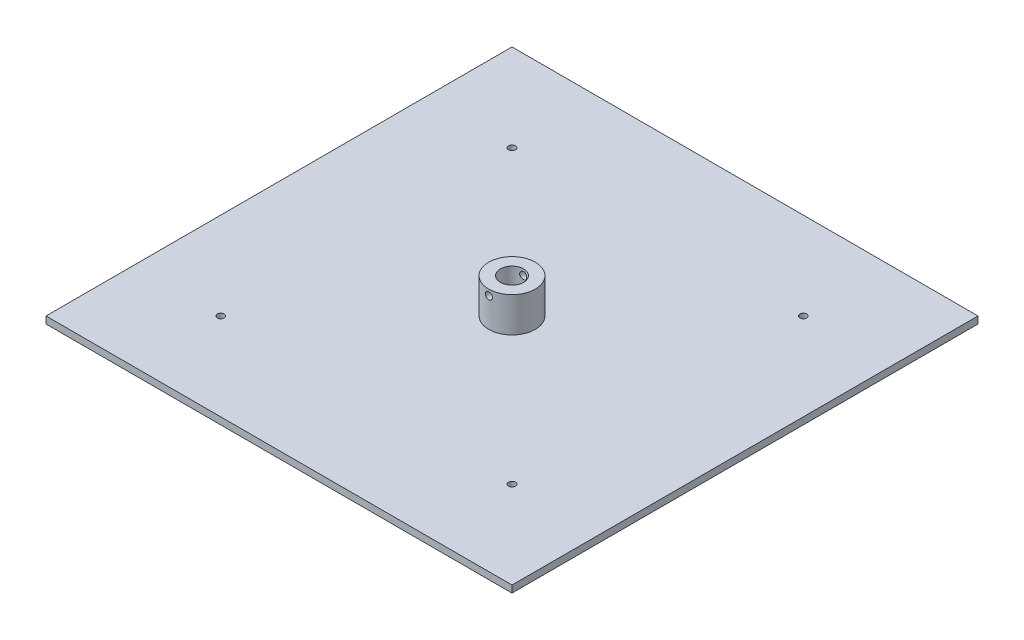
ISO-10303-21;
HEADER;
FILE_DESCRIPTION(('STEP AP214'),'2;1');
FILE_NAME('part.step','',(''),(''),'','','');
FILE_SCHEMA(('AUTOMOTIVE_DESIGN { 1 0 10303 214 1 1 1 1 }'));
ENDSEC;
DATA;
#1=APPLICATION_CONTEXT('core data for automotive mechanical design processes');
#2=APPLICATION_PROTOCOL_DEFINITION('international standard','automotive_design',2000,#1);
#3=PRODUCT_CONTEXT('',#1,'mechanical');
#4=PRODUCT('Part','Part','',(#3));
#5=PRODUCT_RELATED_PRODUCT_CATEGORY('part','',(#4));
#6=PRODUCT_DEFINITION_FORMATION('','',#4);
#7=PRODUCT_DEFINITION_CONTEXT('part definition',#1,'design');
#8=PRODUCT_DEFINITION('design','',#6,#7);
#9=PRODUCT_DEFINITION_SHAPE('','',#8);
#10=(LENGTH_UNIT() NAMED_UNIT(*) SI_UNIT(.MILLI.,.METRE.));
#11=(NAMED_UNIT(*) PLANE_ANGLE_UNIT() SI_UNIT($,.RADIAN.));
#12=(NAMED_UNIT(*) SI_UNIT($,.STERADIAN.) SOLID_ANGLE_UNIT());
#13=UNCERTAINTY_MEASURE_WITH_UNIT(LENGTH_MEASURE(1.E-05),#10,'distance_accuracy_value','');
#14=(GEOMETRIC_REPRESENTATION_CONTEXT(3) GLOBAL_UNCERTAINTY_ASSIGNED_CONTEXT((#13)) GLOBAL_UNIT_ASSIGNED_CONTEXT((#10,
#11,#12)) REPRESENTATION_CONTEXT('',''));
#15=CARTESIAN_POINT('',(0.,0.,0.));
#16=DIRECTION('',(0.,0.,1.));
#17=DIRECTION('',(1.,0.,0.));
#18=AXIS2_PLACEMENT_3D('',#15,#16,#17);
#19=CARTESIAN_POINT('',(0.,6.,0.));
#20=DIRECTION('',(0.,1.,0.));
#21=DIRECTION('',(0.,0.,1.));
#22=AXIS2_PLACEMENT_3D('',#19,#20,#21);
#23=PLANE('',#22);
#24=CARTESIAN_POINT('',(0.,6.,0.));
#25=DIRECTION('',(0.,1.,0.));
#26=DIRECTION('',(0.,0.,1.));
#27=AXIS2_PLACEMENT_3D('',#24,#25,#26);
#28=CIRCLE('',#27,20.);
#29=CARTESIAN_POINT('',(0.,6.,20.));
#30=VERTEX_POINT('',#29);
#31=EDGE_CURVE('E230',#30,#30,#28,.T.);
#32=ORIENTED_EDGE('',*,*,#31,.F.);
#33=EDGE_LOOP('',(#32));
#34=FACE_BOUND('',#33,.T.);
#35=CARTESIAN_POINT('',(125.000000000003,6.,125.));
#36=DIRECTION('',(0.,1.,0.));
#37=DIRECTION('',(0.,0.,1.));
#38=AXIS2_PLACEMENT_3D('',#35,#36,#37);
#39=CIRCLE('',#38,2.99999999999999);
#40=CARTESIAN_POINT('',(125.000000000003,6.,128.));
#41=VERTEX_POINT('',#40);
#42=EDGE_CURVE('E234',#41,#41,#39,.T.);
#43=ORIENTED_EDGE('',*,*,#42,.F.);
#44=EDGE_LOOP('',(#43));
#45=FACE_BOUND('',#44,.T.);
#46=CARTESIAN_POINT('',(-125.,6.,-125.));
#47=DIRECTION('',(0.,1.,0.));
#48=DIRECTION('',(0.,0.,1.));
#49=AXIS2_PLACEMENT_3D('',#46,#47,#48);
#50=CIRCLE('',#49,3.00000000000001);
#51=CARTESIAN_POINT('',(-125.,6.,-122.));
#52=VERTEX_POINT('',#51);
#53=EDGE_CURVE('E120',#52,#52,#50,.T.);
#54=ORIENTED_EDGE('',*,*,#53,.F.);
#55=EDGE_LOOP('',(#54));
#56=FACE_BOUND('',#55,.T.);
#57=DIRECTION('',(0.,0.,1.));
#58=VECTOR('',#57,1.);
#59=CARTESIAN_POINT('',(-200.,6.,-200.));
#60=LINE('',#59,#58);
#61=CARTESIAN_POINT('',(-200.,6.,-200.));
#62=VERTEX_POINT('',#61);
#63=CARTESIAN_POINT('',(-200.,6.,200.));
#64=VERTEX_POINT('',#63);
#65=EDGE_CURVE('E99',#62,#64,#60,.T.);
#66=ORIENTED_EDGE('',*,*,#65,.T.);
#67=DIRECTION('',(1.,0.,0.));
#68=VECTOR('',#67,1.);
#69=CARTESIAN_POINT('',(-200.,6.,200.));
#70=LINE('',#69,#68);
#71=CARTESIAN_POINT('',(200.,6.,200.));
#72=VERTEX_POINT('',#71);
#73=EDGE_CURVE('E94',#64,#72,#70,.T.);
#74=ORIENTED_EDGE('',*,*,#73,.T.);
#75=DIRECTION('',(0.,0.,-1.));
#76=VECTOR('',#75,1.);
#77=CARTESIAN_POINT('',(200.,6.,-200.));
#78=LINE('',#77,#76);
#79=CARTESIAN_POINT('',(200.,6.,-200.));
#80=VERTEX_POINT('',#79);
#81=EDGE_CURVE('E97',#72,#80,#78,.T.);
#82=ORIENTED_EDGE('',*,*,#81,.T.);
#83=DIRECTION('',(-1.,0.,0.));
#84=VECTOR('',#83,1.);
#85=CARTESIAN_POINT('',(-200.,6.,-200.));
#86=LINE('',#85,#84);
#87=EDGE_CURVE('E64',#80,#62,#86,.T.);
#88=ORIENTED_EDGE('',*,*,#87,.T.);
#89=EDGE_LOOP('',(#66,#74,#82,#88));
#90=FACE_BOUND('',#89,.T.);
#91=CARTESIAN_POINT('',(125.,6.,-125.));
#92=DIRECTION('',(0.,1.,0.));
#93=DIRECTION('',(0.,0.,1.));
#94=AXIS2_PLACEMENT_3D('',#91,#92,#93);
#95=CIRCLE('',#94,2.99999999999997);
#96=CARTESIAN_POINT('',(125.,6.,-122.));
#97=VERTEX_POINT('',#96);
#98=EDGE_CURVE('E240',#97,#97,#95,.T.);
#99=ORIENTED_EDGE('',*,*,#98,.F.);
#100=EDGE_LOOP('',(#99));
#101=FACE_BOUND('',#100,.T.);
#102=CARTESIAN_POINT('',(-124.999999999997,6.,125.));
#103=DIRECTION('',(0.,1.,0.));
#104=DIRECTION('',(0.,0.,1.));
#105=AXIS2_PLACEMENT_3D('',#102,#103,#104);
#106=CIRCLE('',#105,3.00000000000001);
#107=CARTESIAN_POINT('',(-124.999999999997,6.,128.));
#108=VERTEX_POINT('',#107);
#109=EDGE_CURVE('E222',#108,#108,#106,.T.);
#110=ORIENTED_EDGE('',*,*,#109,.F.);
#111=EDGE_LOOP('',(#110));
#112=FACE_BOUND('',#111,.T.);
#113=ADVANCED_FACE('F39',(#34,#45,#56,#90,#101,#112),#23,.T.);
#114=CARTESIAN_POINT('',(0.,0.,0.));
#115=DIRECTION('',(0.,1.,0.));
#116=DIRECTION('',(0.,0.,1.));
#117=AXIS2_PLACEMENT_3D('',#114,#115,#116);
#118=PLANE('',#117);
#119=CARTESIAN_POINT('',(0.,0.,0.));
#120=DIRECTION('',(0.,1.,0.));
#121=DIRECTION('',(0.,0.,1.));
#122=AXIS2_PLACEMENT_3D('',#119,#120,#121);
#123=CIRCLE('',#122,10.);
#124=CARTESIAN_POINT('',(0.,0.,10.));
#125=VERTEX_POINT('',#124);
#126=EDGE_CURVE('E263',#125,#125,#123,.T.);
#127=ORIENTED_EDGE('',*,*,#126,.T.);
#128=EDGE_LOOP('',(#127));
#129=FACE_BOUND('',#128,.T.);
#130=DIRECTION('',(0.,0.,1.));
#131=VECTOR('',#130,1.);
#132=CARTESIAN_POINT('',(-200.,0.,-200.));
#133=LINE('',#132,#131);
#134=CARTESIAN_POINT('',(-200.,0.,-200.));
#135=VERTEX_POINT('',#134);
#136=CARTESIAN_POINT('',(-200.,0.,200.));
#137=VERTEX_POINT('',#136);
#138=EDGE_CURVE('E116',#135,#137,#133,.T.);
#139=ORIENTED_EDGE('',*,*,#138,.F.);
#140=DIRECTION('',(-1.,0.,0.));
#141=VECTOR('',#140,1.);
#142=CARTESIAN_POINT('',(-200.,0.,-200.));
#143=LINE('',#142,#141);
#144=CARTESIAN_POINT('',(200.,0.,-200.));
#145=VERTEX_POINT('',#144);
#146=EDGE_CURVE('E87',#145,#135,#143,.T.);
#147=ORIENTED_EDGE('',*,*,#146,.F.);
#148=DIRECTION('',(0.,0.,-1.));
#149=VECTOR('',#148,1.);
#150=CARTESIAN_POINT('',(200.,0.,-200.));
#151=LINE('',#150,#149);
#152=CARTESIAN_POINT('',(200.,0.,200.));
#153=VERTEX_POINT('',#152);
#154=EDGE_CURVE('E81',#153,#145,#151,.T.);
#155=ORIENTED_EDGE('',*,*,#154,.F.);
#156=DIRECTION('',(1.,0.,0.));
#157=VECTOR('',#156,1.);
#158=CARTESIAN_POINT('',(-200.,0.,200.));
#159=LINE('',#158,#157);
#160=EDGE_CURVE('E104',#137,#153,#159,.T.);
#161=ORIENTED_EDGE('',*,*,#160,.F.);
#162=EDGE_LOOP('',(#139,#147,#155,#161));
#163=FACE_BOUND('',#162,.T.);
#164=CARTESIAN_POINT('',(-125.,0.,-125.));
#165=DIRECTION('',(0.,1.,0.));
#166=DIRECTION('',(0.,0.,1.));
#167=AXIS2_PLACEMENT_3D('',#164,#165,#166);
#168=CIRCLE('',#167,3.00000000000001);
#169=CARTESIAN_POINT('',(-125.,0.,-122.));
#170=VERTEX_POINT('',#169);
#171=EDGE_CURVE('E208',#170,#170,#168,.T.);
#172=ORIENTED_EDGE('',*,*,#171,.T.);
#173=EDGE_LOOP('',(#172));
#174=FACE_BOUND('',#173,.T.);
#175=CARTESIAN_POINT('',(125.,0.,-125.));
#176=DIRECTION('',(0.,1.,0.));
#177=DIRECTION('',(0.,0.,1.));
#178=AXIS2_PLACEMENT_3D('',#175,#176,#177);
#179=CIRCLE('',#178,2.99999999999997);
#180=CARTESIAN_POINT('',(125.,0.,-122.));
#181=VERTEX_POINT('',#180);
#182=EDGE_CURVE('E212',#181,#181,#179,.T.);
#183=ORIENTED_EDGE('',*,*,#182,.T.);
#184=EDGE_LOOP('',(#183));
#185=FACE_BOUND('',#184,.T.);
#186=CARTESIAN_POINT('',(125.000000000003,0.,125.));
#187=DIRECTION('',(0.,1.,0.));
#188=DIRECTION('',(0.,0.,1.));
#189=AXIS2_PLACEMENT_3D('',#186,#187,#188);
#190=CIRCLE('',#189,2.99999999999999);
#191=CARTESIAN_POINT('',(125.000000000003,0.,128.));
#192=VERTEX_POINT('',#191);
#193=EDGE_CURVE('E216',#192,#192,#190,.T.);
#194=ORIENTED_EDGE('',*,*,#193,.T.);
#195=EDGE_LOOP('',(#194));
#196=FACE_BOUND('',#195,.T.);
#197=CARTESIAN_POINT('',(-124.999999999997,0.,125.));
#198=DIRECTION('',(0.,1.,0.));
#199=DIRECTION('',(0.,0.,1.));
#200=AXIS2_PLACEMENT_3D('',#197,#198,#199);
#201=CIRCLE('',#200,3.00000000000001);
#202=CARTESIAN_POINT('',(-124.999999999997,0.,128.));
#203=VERTEX_POINT('',#202);
#204=EDGE_CURVE('E219',#203,#203,#201,.T.);
#205=ORIENTED_EDGE('',*,*,#204,.T.);
#206=EDGE_LOOP('',(#205));
#207=FACE_BOUND('',#206,.T.);
#208=ADVANCED_FACE('F187',(#129,#163,#174,#185,#196,#207),#118,.F.);
#209=CARTESIAN_POINT('',(-200.,6.,-200.));
#210=DIRECTION('',(1.,0.,0.));
#211=DIRECTION('',(0.,0.,-1.));
#212=AXIS2_PLACEMENT_3D('',#209,#210,#211);
#213=PLANE('',#212);
#214=ORIENTED_EDGE('',*,*,#138,.T.);
#215=DIRECTION('',(0.,-1.,0.));
#216=VECTOR('',#215,1.);
#217=CARTESIAN_POINT('',(-200.,6.,200.));
#218=LINE('',#217,#216);
#219=EDGE_CURVE('E11',#64,#137,#218,.T.);
#220=ORIENTED_EDGE('',*,*,#219,.F.);
#221=ORIENTED_EDGE('',*,*,#65,.F.);
#222=DIRECTION('',(0.,-1.,0.));
#223=VECTOR('',#222,1.);
#224=CARTESIAN_POINT('',(-200.,6.,-200.));
#225=LINE('',#224,#223);
#226=EDGE_CURVE('E112',#62,#135,#225,.T.);
#227=ORIENTED_EDGE('',*,*,#226,.T.);
#228=EDGE_LOOP('',(#214,#220,#221,#227));
#229=FACE_BOUND('',#228,.T.);
#230=ADVANCED_FACE('F41',(#229),#213,.F.);
#231=CARTESIAN_POINT('',(-200.,6.,200.));
#232=DIRECTION('',(0.,0.,-1.));
#233=DIRECTION('',(-1.,0.,0.));
#234=AXIS2_PLACEMENT_3D('',#231,#232,#233);
#235=PLANE('',#234);
#236=ORIENTED_EDGE('',*,*,#160,.T.);
#237=DIRECTION('',(0.,-1.,0.));
#238=VECTOR('',#237,1.);
#239=CARTESIAN_POINT('',(200.,6.,200.));
#240=LINE('',#239,#238);
#241=EDGE_CURVE('E55',#72,#153,#240,.T.);
#242=ORIENTED_EDGE('',*,*,#241,.F.);
#243=ORIENTED_EDGE('',*,*,#73,.F.);
#244=ORIENTED_EDGE('',*,*,#219,.T.);
#245=EDGE_LOOP('',(#236,#242,#243,#244));
#246=FACE_BOUND('',#245,.T.);
#247=ADVANCED_FACE('F103',(#246),#235,.F.);
#248=CARTESIAN_POINT('',(200.,6.,-200.));
#249=DIRECTION('',(-1.,0.,0.));
#250=DIRECTION('',(0.,0.,1.));
#251=AXIS2_PLACEMENT_3D('',#248,#249,#250);
#252=PLANE('',#251);
#253=ORIENTED_EDGE('',*,*,#154,.T.);
#254=DIRECTION('',(0.,-1.,0.));
#255=VECTOR('',#254,1.);
#256=CARTESIAN_POINT('',(200.,6.,-200.));
#257=LINE('',#256,#255);
#258=EDGE_CURVE('E106',#80,#145,#257,.T.);
#259=ORIENTED_EDGE('',*,*,#258,.F.);
#260=ORIENTED_EDGE('',*,*,#81,.F.);
#261=ORIENTED_EDGE('',*,*,#241,.T.);
#262=EDGE_LOOP('',(#253,#259,#260,#261));
#263=FACE_BOUND('',#262,.T.);
#264=ADVANCED_FACE('F108',(#263),#252,.F.);
#265=CARTESIAN_POINT('',(-200.,6.,-200.));
#266=DIRECTION('',(0.,0.,1.));
#267=DIRECTION('',(1.,0.,0.));
#268=AXIS2_PLACEMENT_3D('',#265,#266,#267);
#269=PLANE('',#268);
#270=ORIENTED_EDGE('',*,*,#146,.T.);
#271=ORIENTED_EDGE('',*,*,#226,.F.);
#272=ORIENTED_EDGE('',*,*,#87,.F.);
#273=ORIENTED_EDGE('',*,*,#258,.T.);
#274=EDGE_LOOP('',(#270,#271,#272,#273));
#275=FACE_BOUND('',#274,.T.);
#276=ADVANCED_FACE('F183',(#275),#269,.F.);
#277=CARTESIAN_POINT('',(-125.,6.,-125.));
#278=DIRECTION('',(0.,-1.,0.));
#279=DIRECTION('',(0.,0.,-1.));
#280=AXIS2_PLACEMENT_3D('',#277,#278,#279);
#281=CYLINDRICAL_SURFACE('',#280,3.00000000000001);
#282=ORIENTED_EDGE('',*,*,#53,.T.);
#283=EDGE_LOOP('',(#282));
#284=FACE_BOUND('',#283,.T.);
#285=ORIENTED_EDGE('',*,*,#171,.F.);
#286=EDGE_LOOP('',(#285));
#287=FACE_BOUND('',#286,.T.);
#288=ADVANCED_FACE('F179',(#284,#287),#281,.F.);
#289=CARTESIAN_POINT('',(125.,6.,-125.));
#290=DIRECTION('',(0.,-1.,0.));
#291=DIRECTION('',(0.,0.,-1.));
#292=AXIS2_PLACEMENT_3D('',#289,#290,#291);
#293=CYLINDRICAL_SURFACE('',#292,2.99999999999997);
#294=ORIENTED_EDGE('',*,*,#98,.T.);
#295=EDGE_LOOP('',(#294));
#296=FACE_BOUND('',#295,.T.);
#297=ORIENTED_EDGE('',*,*,#182,.F.);
#298=EDGE_LOOP('',(#297));
#299=FACE_BOUND('',#298,.T.);
#300=ADVANCED_FACE('F175',(#296,#299),#293,.F.);
#301=CARTESIAN_POINT('',(125.000000000003,6.,125.));
#302=DIRECTION('',(0.,-1.,0.));
#303=DIRECTION('',(0.,0.,-1.));
#304=AXIS2_PLACEMENT_3D('',#301,#302,#303);
#305=CYLINDRICAL_SURFACE('',#304,2.99999999999999);
#306=ORIENTED_EDGE('',*,*,#42,.T.);
#307=EDGE_LOOP('',(#306));
#308=FACE_BOUND('',#307,.T.);
#309=ORIENTED_EDGE('',*,*,#193,.F.);
#310=EDGE_LOOP('',(#309));
#311=FACE_BOUND('',#310,.T.);
#312=ADVANCED_FACE('F171',(#308,#311),#305,.F.);
#313=CARTESIAN_POINT('',(-124.999999999997,6.,125.));
#314=DIRECTION('',(0.,-1.,0.));
#315=DIRECTION('',(0.,0.,-1.));
#316=AXIS2_PLACEMENT_3D('',#313,#314,#315);
#317=CYLINDRICAL_SURFACE('',#316,3.00000000000001);
#318=ORIENTED_EDGE('',*,*,#109,.T.);
#319=EDGE_LOOP('',(#318));
#320=FACE_BOUND('',#319,.T.);
#321=ORIENTED_EDGE('',*,*,#204,.F.);
#322=EDGE_LOOP('',(#321));
#323=FACE_BOUND('',#322,.T.);
#324=ADVANCED_FACE('F166',(#320,#323),#317,.F.);
#325=CARTESIAN_POINT('',(0.,36.,0.));
#326=DIRECTION('',(0.,-1.,0.));
#327=DIRECTION('',(0.,0.,-1.));
#328=AXIS2_PLACEMENT_3D('',#325,#326,#327);
#329=CYLINDRICAL_SURFACE('',#328,20.);
#330=CARTESIAN_POINT('',(-2.99999999999999,31.,19.7737199332852));
#331=CARTESIAN_POINT('',(-2.9999930821446,31.1674911385951,19.7737227330056));
#332=CARTESIAN_POINT('',(-2.9859259277613,31.3350795015465,19.775871033033));
#333=CARTESIAN_POINT('',(-2.93004393313152,31.6655706298079,19.7842262942551));
#334=CARTESIAN_POINT('',(-2.88820202805161,31.8284686629683,19.7904372141437));
#335=CARTESIAN_POINT('',(-2.77805052196485,32.1447475108791,19.8061987802088));
#336=CARTESIAN_POINT('',(-2.70976123362878,32.2981355250804,19.8157468627605));
#337=CARTESIAN_POINT('',(-2.54870126175497,32.5912540615481,19.8371038821332));
#338=CARTESIAN_POINT('',(-2.4559339485972,32.7309864604296,19.8489125076385));
#339=CARTESIAN_POINT('',(-2.24775804837139,32.9939676335076,19.8735657849959));
#340=CARTESIAN_POINT('',(-2.13219211169646,33.1170912268132,19.8864172491706));
#341=CARTESIAN_POINT('',(-1.88203921088868,33.3422749713113,19.9116473633715));
#342=CARTESIAN_POINT('',(-1.74745120157304,33.444333964334,19.9240259873698));
#343=CARTESIAN_POINT('',(-1.4622727161055,33.6249532633826,19.9469869485662));
#344=CARTESIAN_POINT('',(-1.31160845473153,33.7033983006449,19.9575603687121));
#345=CARTESIAN_POINT('',(-0.99905770021394,33.8338231976164,19.9756441349274));
#346=CARTESIAN_POINT('',(-0.837171800541349,33.8858044556858,19.9831546428387));
#347=CARTESIAN_POINT('',(-0.508062246181135,33.9614467770617,19.9942182959558));
#348=CARTESIAN_POINT('',(-0.340887768779729,33.9853174527743,19.9978007177469));
#349=CARTESIAN_POINT('',(-0.00487040803895543,34.0047118696498,20.0007048953916));
#350=CARTESIAN_POINT('',(0.163972382031494,34.0002371866394,20.0000268880988));
#351=CARTESIAN_POINT('',(0.497103436401039,33.9632333244751,19.9945099932159));
#352=CARTESIAN_POINT('',(0.661417382800015,33.930929656417,19.9897045530496));
#353=CARTESIAN_POINT('',(0.982265658286274,33.8395387873548,19.976510004557));
#354=CARTESIAN_POINT('',(1.13879978702696,33.7804508969971,19.9681208039948));
#355=CARTESIAN_POINT('',(1.44032756154063,33.6369380061658,19.9486438774641));
#356=CARTESIAN_POINT('',(1.58527534464719,33.5524180697825,19.9375460703128));
#357=CARTESIAN_POINT('',(1.85901581430035,33.36050961266,19.9138887649084));
#358=CARTESIAN_POINT('',(1.98780743654347,33.2531195865863,19.9013291704637));
#359=CARTESIAN_POINT('',(2.22690896544529,33.0172631023468,19.8760031638525));
#360=CARTESIAN_POINT('',(2.33702465901893,32.8885997560598,19.8632359324651));
#361=CARTESIAN_POINT('',(2.53413198677625,32.6145178457525,19.8390540890705));
#362=CARTESIAN_POINT('',(2.62112347855997,32.4690991785602,19.827639485393));
#363=CARTESIAN_POINT('',(2.76953929069209,32.1654320741187,19.8074555057371));
#364=CARTESIAN_POINT('',(2.83094364540163,32.0071737326752,19.7986881969058));
#365=CARTESIAN_POINT('',(2.92624672417758,31.6824294897052,19.7848280579812));
#366=CARTESIAN_POINT('',(2.96014738674651,31.5159441689065,19.779734968926));
#367=CARTESIAN_POINT('',(2.9992144017331,31.181199820845,19.7738490279005));
#368=CARTESIAN_POINT('',(3.00465606530104,31.0129736235969,19.7730149760515));
#369=CARTESIAN_POINT('',(2.98738114039638,30.6780116103653,19.7756321587431));
#370=CARTESIAN_POINT('',(2.96466542564604,30.5112757482985,19.7790832603156));
#371=CARTESIAN_POINT('',(2.89195405905532,30.1848803640687,19.7898440492291));
#372=CARTESIAN_POINT('',(2.84209557055641,30.0251895901168,19.7971343296572));
#373=CARTESIAN_POINT('',(2.71665663894173,29.7164318159028,19.8147360365154));
#374=CARTESIAN_POINT('',(2.64107492552777,29.5673653407436,19.8250476121435));
#375=CARTESIAN_POINT('',(2.46567355990646,29.2828534793299,19.8476271137413));
#376=CARTESIAN_POINT('',(2.36567569123532,29.1475191054404,19.8599091855998));
#377=CARTESIAN_POINT('',(2.14452833674402,28.8954542802524,19.8850031886671));
#378=CARTESIAN_POINT('',(2.02337765489359,28.7787248816377,19.8978151498058));
#379=CARTESIAN_POINT('',(1.76215123925636,28.5661947867328,19.9226541043477));
#380=CARTESIAN_POINT('',(1.62192625354391,28.4705765435151,19.9346736692085));
#381=CARTESIAN_POINT('',(1.32724416052736,28.3042541894747,19.9564581006403));
#382=CARTESIAN_POINT('',(1.17278744272088,28.23354939707,19.9662230288913));
#383=CARTESIAN_POINT('',(0.854595991722293,28.1193525150239,19.9823653932159));
#384=CARTESIAN_POINT('',(0.690897717508605,28.0757606658433,19.9887552343579));
#385=CARTESIAN_POINT('',(0.358401631002385,28.0167042409251,19.997479533138));
#386=CARTESIAN_POINT('',(0.189604156261158,28.0012378075017,19.9998142586162));
#387=CARTESIAN_POINT('',(-0.146529181721633,27.9989165909012,20.0001625811827));
#388=CARTESIAN_POINT('',(-0.31386314042409,28.011782638246,19.9982183404754));
#389=CARTESIAN_POINT('',(-0.643959590646228,28.0651627768416,19.9903122103834));
#390=CARTESIAN_POINT('',(-0.806722096793077,28.1056767796172,19.9843503338553));
#391=CARTESIAN_POINT('',(-1.12297874875927,28.2131037511404,19.9690757348472));
#392=CARTESIAN_POINT('',(-1.27647958629737,28.2799973902775,19.9597654663314));
#393=CARTESIAN_POINT('',(-1.57012223579339,28.4382549759667,19.9388166899175));
#394=CARTESIAN_POINT('',(-1.71026361384214,28.5296197169622,19.9271781064349));
#395=CARTESIAN_POINT('',(-1.97462517038318,28.7352353976569,19.9027302126952));
#396=CARTESIAN_POINT('',(-2.09868413289002,28.8496924516271,19.8899109684125));
#397=CARTESIAN_POINT('',(-2.32593616780809,29.0978101461665,19.8646200338864));
#398=CARTESIAN_POINT('',(-2.4291243359899,29.2314752876695,19.8521484259231));
#399=CARTESIAN_POINT('',(-2.61222621645124,29.5150979664473,19.8288896801826));
#400=CARTESIAN_POINT('',(-2.69200588578923,29.665142833972,19.8181124016445));
#401=CARTESIAN_POINT('',(-2.82511227740616,29.9765935534543,19.7995781807762));
#402=CARTESIAN_POINT('',(-2.87846645148993,30.1379874156965,19.7918181058705));
#403=CARTESIAN_POINT('',(-2.94509903780533,30.4167548725231,19.7819897106961));
#404=CARTESIAN_POINT('',(-2.96565539560941,30.5324067938525,19.7789049876333));
#405=CARTESIAN_POINT('',(-2.99310821153046,30.7653565834648,19.7747691313545));
#406=CARTESIAN_POINT('',(-3.00000484670226,30.8826544303937,19.7737179717797));
#407=CARTESIAN_POINT('',(-2.99999999999999,31.,19.7737199332852));
#408=B_SPLINE_CURVE_WITH_KNOTS('',3,(#330,#331,#332,#333,#334,#335,#336,#337,#338,#339,#340,
#341,#342,#343,#344,#345,#346,#347,#348,#349,#350,#351,#352,#353,#354,#355,#356,#357,#358,#359,
#360,#361,#362,#363,#364,#365,#366,#367,#368,#369,#370,#371,#372,#373,#374,#375,#376,#377,#378,
#379,#380,#381,#382,#383,#384,#385,#386,#387,#388,#389,#390,#391,#392,#393,#394,#395,#396,#397,
#398,#399,#400,#401,#402,#403,#404,#405,#406,#407),.UNSPECIFIED.,.T.,.F.,(4,2,2,2,2,2,2,2,2,2,2,
2,2,2,2,2,2,2,2,2,2,2,2,2,2,2,2,2,2,2,2,2,2,2,2,2,2,2,4),(0.,0.502044503631421,1.00457893916572,
1.50672817071346,2.00880829736476,2.51448317302426,3.02018584419845,3.52831844215775,
4.03642418733212,4.54071665073004,5.04498107882958,5.54519725035666,6.04542629683013,
6.54754632777117,7.04969941902754,7.55679089336749,8.0638854903291,8.57137503550486,
9.07882880892891,9.58136429211696,10.0838841820404,10.5838878961896,11.0839163057644,
11.5877097200681,12.0915316292781,12.5995507551124,13.1075559814792,13.6136808178639,
14.1197722234515,14.6208992724886,15.1220247178985,15.6227836451987,16.1235588313842,
16.6290190002615,17.1345978047793,17.643017576552,18.1509080689783,18.5026488378993,
18.8543850475909),.UNSPECIFIED.);
#409=CARTESIAN_POINT('',(-2.99999999999999,31.,19.7737199332852));
#410=VERTEX_POINT('',#409);
#411=EDGE_CURVE('E149',#410,#410,#408,.T.);
#412=ORIENTED_EDGE('',*,*,#411,.T.);
#413=EDGE_LOOP('',(#412));
#414=FACE_BOUND('',#413,.T.);
#415=CARTESIAN_POINT('',(0.,34.,-20.));
#416=CARTESIAN_POINT('',(-0.167503088963283,33.9999930923695,-19.9999973154259));
#417=CARTESIAN_POINT('',(-0.335103370164262,33.9859239983187,-19.9978736507408));
#418=CARTESIAN_POINT('',(-0.665619255989824,33.9300336000345,-19.9896063194637));
#419=CARTESIAN_POINT('',(-0.828530137948455,33.8881852741102,-19.9834587387695));
#420=CARTESIAN_POINT('',(-1.14483617244372,33.7780149900647,-19.9678344243905));
#421=CARTESIAN_POINT('',(-1.29823841565359,33.7097130409881,-19.9583602074184));
#422=CARTESIAN_POINT('',(-1.5913808572705,33.5486232411663,-19.9371295182345));
#423=CARTESIAN_POINT('',(-1.73112294945037,33.4558387911653,-19.9253733630555));
#424=CARTESIAN_POINT('',(-1.99409343912425,33.2476454701202,-19.900783419829));
#425=CARTESIAN_POINT('',(-2.11719966445099,33.1320830875836,-19.8879426778066));
#426=CARTESIAN_POINT('',(-2.34234981337896,32.8819446222123,-19.8626852226648));
#427=CARTESIAN_POINT('',(-2.44439252545871,32.747367446443,-19.8502685339701));
#428=CARTESIAN_POINT('',(-2.62499458999885,32.462198712955,-19.8271975491745));
#429=CARTESIAN_POINT('',(-2.70343574074409,32.3115315060373,-19.8165522395006));
#430=CARTESIAN_POINT('',(-2.83385264342111,31.9989743587091,-19.7983242261254));
#431=CARTESIAN_POINT('',(-2.88582983778325,31.8370850305122,-19.790741355509));
#432=CARTESIAN_POINT('',(-2.96146397597821,31.5079639162566,-19.7795651243735));
#433=CARTESIAN_POINT('',(-2.98533007281035,31.340781213184,-19.775942314825));
#434=CARTESIAN_POINT('',(-3.00471248067864,31.0047476680254,-19.7730069794116));
#435=CARTESIAN_POINT('',(-3.00023041947592,30.835896922275,-19.7736942060629));
#436=CARTESIAN_POINT('',(-2.96321466501574,30.5027978396117,-19.7792743670482));
#437=CARTESIAN_POINT('',(-2.930913918555,30.3385229470304,-19.784132375231));
#438=CARTESIAN_POINT('',(-2.83954234807468,30.0177512622569,-19.7974521625273));
#439=CARTESIAN_POINT('',(-2.78047076675624,29.8612546902385,-19.8059140435876));
#440=CARTESIAN_POINT('',(-2.63699207059472,29.5597732574343,-19.8255267109096));
#441=CARTESIAN_POINT('',(-2.55248628566395,29.4148360618152,-19.8366879353305));
#442=CARTESIAN_POINT('',(-2.36060826257909,29.1411108084361,-19.860434151491));
#443=CARTESIAN_POINT('',(-2.25323452364956,29.0123238114613,-19.87301923665));
#444=CARTESIAN_POINT('',(-2.01738986156495,28.7732046785206,-19.8983494611242));
#445=CARTESIAN_POINT('',(-1.888718659284,28.6630700194273,-19.9110949422563));
#446=CARTESIAN_POINT('',(-1.61461417978837,28.4659281309855,-19.9351929529692));
#447=CARTESIAN_POINT('',(-1.46918082917634,28.3789210029122,-19.9465454764502));
#448=CARTESIAN_POINT('',(-1.16550919642737,28.2304938270009,-19.9665903117079));
#449=CARTESIAN_POINT('',(-1.00726335567356,28.1690890163194,-19.9752810385086));
#450=CARTESIAN_POINT('',(-0.682546364974121,28.0737812206293,-19.9890098111414));
#451=CARTESIAN_POINT('',(-0.516075771905202,28.0398763763689,-19.9940481039093));
#452=CARTESIAN_POINT('',(-0.181339135287294,28.0007935403666,-19.9998716226774));
#453=CARTESIAN_POINT('',(-0.0131054637409429,27.9953440572414,-20.0006970418078));
#454=CARTESIAN_POINT('',(0.321873355324563,28.0126060106221,-19.9981112203045));
#455=CARTESIAN_POINT('',(0.488618548763752,28.0353165753362,-19.9947001108274));
#456=CARTESIAN_POINT('',(0.815064774862812,28.1080282003551,-19.9840493723067));
#457=CARTESIAN_POINT('',(0.974795926159671,28.1578969920617,-19.9768283041597));
#458=CARTESIAN_POINT('',(1.28362991728599,28.2833699949235,-19.9593647131674));
#459=CARTESIAN_POINT('',(1.43273225759019,28.3589754146673,-19.9491220484313));
#460=CARTESIAN_POINT('',(1.71726995858384,28.5344124491277,-19.9266536493737));
#461=CARTESIAN_POINT('',(1.85259801978313,28.6344162800255,-19.9144140325349));
#462=CARTESIAN_POINT('',(2.10464734635541,28.8555716232575,-19.8893572602433));
#463=CARTESIAN_POINT('',(2.2213675295868,28.9767243646493,-19.8765400712573));
#464=CARTESIAN_POINT('',(2.4338756991439,29.237947066353,-19.8516452860899));
#465=CARTESIAN_POINT('',(2.52948169494842,29.3781658503895,-19.8395747203518));
#466=CARTESIAN_POINT('',(2.69578258541168,29.6728320810235,-19.8176643820981));
#467=CARTESIAN_POINT('',(2.76647815312871,29.8272791430429,-19.8078245493126));
#468=CARTESIAN_POINT('',(2.88066934647886,30.1454750672463,-19.7915406601729));
#469=CARTESIAN_POINT('',(2.9242607428327,30.3091889219425,-19.7850846601288));
#470=CARTESIAN_POINT('',(2.98331099003172,30.6417180308702,-19.776267645956));
#471=CARTESIAN_POINT('',(2.99877178366132,30.8105329319893,-19.7739063490354));
#472=CARTESIAN_POINT('',(3.00107573338879,31.1466581266316,-19.7735566522168));
#473=CARTESIAN_POINT('',(2.98820504334625,31.3139664835138,-19.77552452667));
#474=CARTESIAN_POINT('',(2.93482459088757,31.644010526647,-19.7835164122235));
#475=CARTESIAN_POINT('',(2.89431487277253,31.8067462202268,-19.7895404168224));
#476=CARTESIAN_POINT('',(2.7869074703733,32.1229461644686,-19.8049505222459));
#477=CARTESIAN_POINT('',(2.72002978648627,32.2764173408669,-19.8143340743215));
#478=CARTESIAN_POINT('',(2.56181335284617,32.5700072676048,-19.835409091154));
#479=CARTESIAN_POINT('',(2.47047377483003,32.7101255656073,-19.8471006340545));
#480=CARTESIAN_POINT('',(2.26488675318327,32.9744861159503,-19.8716148672988));
#481=CARTESIAN_POINT('',(2.1504273807961,33.0985626664941,-19.8844473576393));
#482=CARTESIAN_POINT('',(1.90229768216566,33.3258491095756,-19.9097157765327));
#483=CARTESIAN_POINT('',(1.76862289670188,33.4290541451523,-19.9221516122152));
#484=CARTESIAN_POINT('',(1.48499141508744,33.6121753532147,-19.9453037158104));
#485=CARTESIAN_POINT('',(1.33494915352952,33.6919602184295,-19.9560101425764));
#486=CARTESIAN_POINT('',(1.02350374049744,33.8250770335161,-19.9744005760592));
#487=CARTESIAN_POINT('',(0.862112554193407,33.8784363801074,-19.9820877113151));
#488=CARTESIAN_POINT('',(0.583331455778656,33.9450826854202,-19.9918187852301));
#489=CARTESIAN_POINT('',(0.467662266990554,33.9656452030776,-19.9948709835911));
#490=CARTESIAN_POINT('',(0.234677943200248,33.9931061954253,-19.9989625189579));
#491=CARTESIAN_POINT('',(0.117362828668833,34.0000048399051,-20.0000018809755));
#492=CARTESIAN_POINT('',(0.,34.,-20.));
#493=B_SPLINE_CURVE_WITH_KNOTS('',3,(#415,#416,#417,#418,#419,#420,#421,#422,#423,#424,#425,
#426,#427,#428,#429,#430,#431,#432,#433,#434,#435,#436,#437,#438,#439,#440,#441,#442,#443,#444,
#445,#446,#447,#448,#449,#450,#451,#452,#453,#454,#455,#456,#457,#458,#459,#460,#461,#462,#463,
#464,#465,#466,#467,#468,#469,#470,#471,#472,#473,#474,#475,#476,#477,#478,#479,#480,#481,#482,
#483,#484,#485,#486,#487,#488,#489,#490,#491,#492),.UNSPECIFIED.,.T.,.F.,(4,2,2,2,2,2,2,2,2,2,2,
2,2,2,2,2,2,2,2,2,2,2,2,2,2,2,2,2,2,2,2,2,2,2,2,2,2,2,4),(0.,0.502080410063325,1.0046499258583,
1.50684004716647,2.00896044839519,2.51458832273686,3.02024527145159,3.52839404790749,
4.03651512451011,4.54083129211847,5.04511850197964,5.54522354391491,6.04534273380722,
6.54742766952317,7.04954556617067,7.55668582510816,8.06382830477334,8.57127217969747,
9.078681743868,9.58124117088508,10.0837850398231,10.5839029793189,11.0840444075254,
11.5878237607381,12.0916324005726,12.5996273316934,13.1076085361766,13.6137844691433,
14.1199254427435,14.6209777652213,15.1220292845912,15.6227014796829,16.1233906293376,
16.6288965993144,17.1345200693746,17.6429264676946,18.1508046652288,18.5025970395761,
18.8543850424658),.UNSPECIFIED.);
#494=CARTESIAN_POINT('',(0.,34.,-20.));
#495=VERTEX_POINT('',#494);
#496=EDGE_CURVE('E156',#495,#495,#493,.T.);
#497=ORIENTED_EDGE('',*,*,#496,.T.);
#498=EDGE_LOOP('',(#497));
#499=FACE_BOUND('',#498,.T.);
#500=CARTESIAN_POINT('',(0.,36.,0.));
#501=DIRECTION('',(0.,1.,0.));
#502=DIRECTION('',(0.,0.,1.));
#503=AXIS2_PLACEMENT_3D('',#500,#501,#502);
#504=CIRCLE('',#503,20.);
#505=CARTESIAN_POINT('',(0.,36.,20.));
#506=VERTEX_POINT('',#505);
#507=EDGE_CURVE('E223',#506,#506,#504,.T.);
#508=ORIENTED_EDGE('',*,*,#507,.F.);
#509=EDGE_LOOP('',(#508));
#510=FACE_BOUND('',#509,.T.);
#511=ORIENTED_EDGE('',*,*,#31,.T.);
#512=EDGE_LOOP('',(#511));
#513=FACE_BOUND('',#512,.T.);
#514=ADVANCED_FACE('F161',(#414,#499,#510,#513),#329,.T.);
#515=CARTESIAN_POINT('',(0.,36.,0.));
#516=DIRECTION('',(0.,1.,0.));
#517=DIRECTION('',(0.,0.,1.));
#518=AXIS2_PLACEMENT_3D('',#515,#516,#517);
#519=PLANE('',#518);
#520=CARTESIAN_POINT('',(0.,36.,0.));
#521=DIRECTION('',(0.,1.,0.));
#522=DIRECTION('',(0.,0.,1.));
#523=AXIS2_PLACEMENT_3D('',#520,#521,#522);
#524=CIRCLE('',#523,10.);
#525=CARTESIAN_POINT('',(0.,36.,10.));
#526=VERTEX_POINT('',#525);
#527=EDGE_CURVE('E265',#526,#526,#524,.T.);
#528=ORIENTED_EDGE('',*,*,#527,.F.);
#529=EDGE_LOOP('',(#528));
#530=FACE_BOUND('',#529,.T.);
#531=ORIENTED_EDGE('',*,*,#507,.T.);
#532=EDGE_LOOP('',(#531));
#533=FACE_BOUND('',#532,.T.);
#534=ADVANCED_FACE('F165',(#530,#533),#519,.T.);
#535=CARTESIAN_POINT('',(0.,0.,0.));
#536=DIRECTION('',(0.,1.,0.));
#537=DIRECTION('',(0.,0.,1.));
#538=AXIS2_PLACEMENT_3D('',#535,#536,#537);
#539=CYLINDRICAL_SURFACE('',#538,10.);
#540=CARTESIAN_POINT('',(0.,28.,10.));
#541=CARTESIAN_POINT('',(0.164577225506599,28.0000019949698,9.99999858501101));
#542=CARTESIAN_POINT('',(0.329174636703058,28.0135877272479,9.99589831387907));
#543=CARTESIAN_POINT('',(0.65357625060976,28.0674427084442,9.97994211187382));
#544=CARTESIAN_POINT('',(0.813379008822838,28.1077199160467,9.96808386779384));
#545=CARTESIAN_POINT('',(1.12346541550905,28.2134920338205,9.93791105003673));
#546=CARTESIAN_POINT('',(1.27376272879074,28.2789497392379,9.91960600500851));
#547=CARTESIAN_POINT('',(1.56124836210626,28.4330721861117,9.87844218475291));
#548=CARTESIAN_POINT('',(1.69843493493934,28.5217400147908,9.85558280384133));
#549=CARTESIAN_POINT('',(1.95974359436749,28.7224480149453,9.80701474385548));
#550=CARTESIAN_POINT('',(2.08343614248868,28.8350332517718,9.78124767314073));
#551=CARTESIAN_POINT('',(2.31049841846647,29.0792184598204,9.73011668420884));
#552=CARTESIAN_POINT('',(2.41386472654881,29.2108216242499,9.70475283449003));
#553=CARTESIAN_POINT('',(2.59960075447415,29.4929415060752,9.65668227987544));
#554=CARTESIAN_POINT('',(2.68144618044426,29.6438169219815,9.63404813327749));
#555=CARTESIAN_POINT('',(2.8184278954952,29.9579785084606,9.59487240788062));
#556=CARTESIAN_POINT('',(2.87357059839946,30.121261687856,9.57832936626621));
#557=CARTESIAN_POINT('',(2.95403267365303,30.4507805322609,9.55381741676869));
#558=CARTESIAN_POINT('',(2.98014392469354,30.6168054877279,9.54562138649067));
#559=CARTESIAN_POINT('',(3.00427461229343,30.9510663124335,9.53805579499535));
#560=CARTESIAN_POINT('',(3.00230085522156,31.1193016361182,9.53868409521143));
#561=CARTESIAN_POINT('',(2.97093954399623,31.446767817217,9.54849488135556));
#562=CARTESIAN_POINT('',(2.9425441052537,31.6061045007245,9.55736777198281));
#563=CARTESIAN_POINT('',(2.86074840854111,31.9176395725469,9.58216712457249));
#564=CARTESIAN_POINT('',(2.80734568283281,32.0698372547487,9.59809428264701));
#565=CARTESIAN_POINT('',(2.67632053307362,32.3652006993215,9.63545466149946));
#566=CARTESIAN_POINT('',(2.59837633869284,32.5082141679105,9.65696032231905));
#567=CARTESIAN_POINT('',(2.42070445177366,32.7794640440204,9.7030197400013));
#568=CARTESIAN_POINT('',(2.32097148005176,32.9076968588276,9.72757423493982));
#569=CARTESIAN_POINT('',(2.09762581531092,33.151372381524,9.77822022595875));
#570=CARTESIAN_POINT('',(1.97318981493394,33.2660573280593,9.80433308620996));
#571=CARTESIAN_POINT('',(1.70652651862793,33.4731079681285,9.85424488126517));
#572=CARTESIAN_POINT('',(1.56429810372177,33.5654722568288,9.8780436703682));
#573=CARTESIAN_POINT('',(1.2647100766856,33.7257198449295,9.92086320138941));
#574=CARTESIAN_POINT('',(1.1072554994959,33.7934350324997,9.93985087336628));
#575=CARTESIAN_POINT('',(0.782490831207034,33.9011991801992,9.97067043664444));
#576=CARTESIAN_POINT('',(0.61518350317916,33.941255857065,9.98250432373999));
#577=CARTESIAN_POINT('',(0.281904485336662,33.9913043557988,9.99736729287077));
#578=CARTESIAN_POINT('',(0.116100195202373,34.0023231716032,10.0006970083558));
#579=CARTESIAN_POINT('',(-0.214999211646767,33.9968616885758,9.99905846483519));
#580=CARTESIAN_POINT('',(-0.380294393381562,33.9803850606971,9.99409131355514));
#581=CARTESIAN_POINT('',(-0.701807210619394,33.921230777777,9.97661393974325));
#582=CARTESIAN_POINT('',(-0.858145545228338,33.8791532248383,9.96427659598829));
#583=CARTESIAN_POINT('',(-1.16150927790904,33.7707135344436,9.9334869568307));
#584=CARTESIAN_POINT('',(-1.30853355405117,33.7043484779243,9.91503392642188));
#585=CARTESIAN_POINT('',(-1.5928743789221,33.5474936690377,9.87339308702631));
#586=CARTESIAN_POINT('',(-1.72988765239933,33.456481318104,9.8501056165928));
#587=CARTESIAN_POINT('',(-1.9870466159603,33.2535504918944,9.80146937528705));
#588=CARTESIAN_POINT('',(-2.10718806471188,33.1416267762247,9.7761200886242));
#589=CARTESIAN_POINT('',(-2.33171489102052,32.8952253832613,9.72506343738007));
#590=CARTESIAN_POINT('',(-2.43536962463001,32.7600762484563,9.69937650065513));
#591=CARTESIAN_POINT('',(-2.61857990144312,32.4737441219731,9.65153030477949));
#592=CARTESIAN_POINT('',(-2.69813607658964,32.3225615508842,9.62937095313121));
#593=CARTESIAN_POINT('',(-2.83034694254315,32.00893501749,9.5913437922631));
#594=CARTESIAN_POINT('',(-2.88312693874021,31.8465476269243,9.57544675673501));
#595=CARTESIAN_POINT('',(-2.96043461630306,31.5146240621395,9.55183188739737));
#596=CARTESIAN_POINT('',(-2.98497197957848,31.3450903584339,9.54411125069387));
#597=CARTESIAN_POINT('',(-3.00443968969929,31.0112769632231,9.53799944941559));
#598=CARTESIAN_POINT('',(-3.00056110615886,30.8470726979012,9.53923294700395));
#599=CARTESIAN_POINT('',(-2.9661501088861,30.5217717931988,9.54998802392189));
#600=CARTESIAN_POINT('',(-2.93561876249407,30.360675029639,9.55950927135902));
#601=CARTESIAN_POINT('',(-2.84953777608685,30.0481092017367,9.58551527389243));
#602=CARTESIAN_POINT('',(-2.79430351014247,29.8965454252826,9.60191209104934));
#603=CARTESIAN_POINT('',(-2.66063014242147,29.6047151223586,9.63980557805266));
#604=CARTESIAN_POINT('',(-2.58218659925722,29.4644507647169,9.6613032238508));
#605=CARTESIAN_POINT('',(-2.40097527610175,29.1936737669475,9.70795352855338));
#606=CARTESIAN_POINT('',(-2.29742552185995,29.0637024774796,9.7332108032858));
#607=CARTESIAN_POINT('',(-2.07034869259555,28.8225950033838,9.78402640899067));
#608=CARTESIAN_POINT('',(-1.94681643426897,28.7114637210644,9.80958481647543));
#609=CARTESIAN_POINT('',(-1.67893152436651,28.5079531754101,9.85901873141573));
#610=CARTESIAN_POINT('',(-1.53407577158121,28.4162171062891,9.88282319531422));
#611=CARTESIAN_POINT('',(-1.23028274796705,28.2585296601919,9.92521360911553));
#612=CARTESIAN_POINT('',(-1.0713521059979,28.192566223451,9.94380199862114));
#613=CARTESIAN_POINT('',(-0.76151542531056,28.0942094486945,9.97204349938619));
#614=CARTESIAN_POINT('',(-0.611573923908467,28.0589766542335,9.9824405476214));
#615=CARTESIAN_POINT('',(-0.307760390461558,28.0118729495168,9.9964188898898));
#616=CARTESIAN_POINT('',(-0.153889019716279,27.9999981345904,10.0000013230948));
#617=CARTESIAN_POINT('',(0.,28.,10.));
#618=B_SPLINE_CURVE_WITH_KNOTS('',3,(#540,#541,#542,#543,#544,#545,#546,#547,#548,#549,#550,
#551,#552,#553,#554,#555,#556,#557,#558,#559,#560,#561,#562,#563,#564,#565,#566,#567,#568,#569,
#570,#571,#572,#573,#574,#575,#576,#577,#578,#579,#580,#581,#582,#583,#584,#585,#586,#587,#588,
#589,#590,#591,#592,#593,#594,#595,#596,#597,#598,#599,#600,#601,#602,#603,#604,#605,#606,#607,
#608,#609,#610,#611,#612,#613,#614,#615,#616,#617),.UNSPECIFIED.,.T.,.F.,(4,2,2,2,2,2,2,2,2,2,2,
2,2,2,2,2,2,2,2,2,2,2,2,2,2,2,2,2,2,2,2,2,2,2,2,2,2,2,4),(0.,0.49316640722522,0.986479929691997,
1.47906735260175,1.9717203288254,2.47711205896382,2.98258874577265,3.49942962008217,
4.01614629086447,4.51839378713197,5.02051956638178,5.50452033395352,5.98856887316002,
6.47924852894238,6.9700472031711,7.48134208096332,7.99266913062141,8.50742093763376,
9.02202907057614,9.51817618877088,10.0142570710065,10.4991349336465,10.9840710918745,
11.4802261140581,11.9765056400038,12.4908080064563,13.0050968850536,13.516956299025,
14.0286401892056,14.5190031093854,15.0093463933232,15.4936008081456,15.9779479511533,
16.4799385136898,16.9820594980412,17.4988599232246,18.0154182319959,18.4766338387004,
18.9377723390686),.UNSPECIFIED.);
#619=CARTESIAN_POINT('',(0.,28.,10.));
#620=VERTEX_POINT('',#619);
#621=EDGE_CURVE('E43',#620,#620,#618,.T.);
#622=ORIENTED_EDGE('',*,*,#621,.T.);
#623=EDGE_LOOP('',(#622));
#624=FACE_BOUND('',#623,.T.);
#625=CARTESIAN_POINT('',(-2.99999999999999,31.,-9.53939201416946));
#626=CARTESIAN_POINT('',(-2.99999795267527,31.1643890958848,-9.5393937145396));
#627=CARTESIAN_POINT('',(-2.98644216334284,31.3287984482881,-9.54368780418137));
#628=CARTESIAN_POINT('',(-2.93271688893498,31.6528104991839,-9.560331566058));
#629=CARTESIAN_POINT('',(-2.89253851147155,31.8124115730029,-9.57268392986936));
#630=CARTESIAN_POINT('',(-2.7870550653991,32.1220694565435,-9.60392204971265));
#631=CARTESIAN_POINT('',(-2.72179178788486,32.2721416592662,-9.62279693406465));
#632=CARTESIAN_POINT('',(-2.56812843835857,32.5592438679906,-9.66493865095134));
#633=CARTESIAN_POINT('',(-2.47972490274104,32.6962719173689,-9.68820614082039));
#634=CARTESIAN_POINT('',(-2.27929508283253,32.9577327811547,-9.73733724371531));
#635=CARTESIAN_POINT('',(-2.16666414351612,33.0816917958926,-9.76325616623271));
#636=CARTESIAN_POINT('',(-1.92227247515919,33.309275902645,-9.81429723873514));
#637=CARTESIAN_POINT('',(-1.79050929092221,33.4128983808998,-9.8394192859541));
#638=CARTESIAN_POINT('',(-1.50822287558737,33.5989253996666,-9.88666429158778));
#639=CARTESIAN_POINT('',(-1.35736804267162,33.6808468488856,-9.90871448684808));
#640=CARTESIAN_POINT('',(-1.0432492907387,33.8179745180855,-9.94668871841369));
#641=CARTESIAN_POINT('',(-0.879988056775815,33.8731864997149,-9.96261407578992));
#642=CARTESIAN_POINT('',(-0.550647705261651,33.953760002181,-9.98615292007178));
#643=CARTESIAN_POINT('',(-0.384782797907595,33.9799302553054,-9.99399114738673));
#644=CARTESIAN_POINT('',(-0.0508436474986201,34.0042346492929,-10.001264030027));
#645=CARTESIAN_POINT('',(0.117230124100751,34.0023746788039,-10.0007004504217));
#646=CARTESIAN_POINT('',(0.445142313200321,33.971214262914,-9.99139207635305));
#647=CARTESIAN_POINT('',(0.605072535282667,33.9427896123803,-9.98290840410475));
#648=CARTESIAN_POINT('',(0.917778426885081,33.8607373280114,-9.95903044225231));
#649=CARTESIAN_POINT('',(1.07055364264578,33.8071080981145,-9.9436357150134));
#650=CARTESIAN_POINT('',(1.36669465270248,33.675575953163,-9.90730441973756));
#651=CARTESIAN_POINT('',(1.50993012938864,33.597397594386,-9.88630539352772));
#652=CARTESIAN_POINT('',(1.78152934756663,33.4192042951429,-9.84099281296778));
#653=CARTESIAN_POINT('',(1.90988954974545,33.3191841740708,-9.81667847277943));
#654=CARTESIAN_POINT('',(2.15332096305837,33.0956044984991,-9.76623100973852));
#655=CARTESIAN_POINT('',(2.26768916079756,32.9712861619492,-9.74006390633503));
#656=CARTESIAN_POINT('',(2.47415303080115,32.7049799642112,-9.68967959784414));
#657=CARTESIAN_POINT('',(2.56624648967452,32.562990349189,-9.66546258669242));
#658=CARTESIAN_POINT('',(2.72627990669511,32.2635210615278,-9.62155806359712));
#659=CARTESIAN_POINT('',(2.79397978469377,32.1059059083825,-9.6019162125849));
#660=CARTESIAN_POINT('',(2.90166725750739,31.7807855832214,-9.5699278496379));
#661=CARTESIAN_POINT('',(2.94166389279494,31.6132836569649,-9.5575789579664));
#662=CARTESIAN_POINT('',(2.99149540565762,31.2798352784976,-9.54209699116239));
#663=CARTESIAN_POINT('',(3.00239892760806,31.1140635522056,-9.53863757349918));
#664=CARTESIAN_POINT('',(2.99671894465741,30.7830541999867,-9.54042384874813));
#665=CARTESIAN_POINT('',(2.98013928742558,30.61781650254,-9.54566832310787));
#666=CARTESIAN_POINT('',(2.92091527148478,30.2970232440566,-9.56395117112154));
#667=CARTESIAN_POINT('',(2.87895922862586,30.1413276714725,-9.57678353015602));
#668=CARTESIAN_POINT('',(2.77097155495853,29.8391966183706,-9.6085828246183));
#669=CARTESIAN_POINT('',(2.70493620685511,29.692762571719,-9.62755070717977));
#670=CARTESIAN_POINT('',(2.54863742393007,29.4089650718556,-9.67011670046269));
#671=CARTESIAN_POINT('',(2.45777128345459,29.2719505580284,-9.69382542139644));
#672=CARTESIAN_POINT('',(2.25510603200766,29.0147237876384,-9.74296411293928));
#673=CARTESIAN_POINT('',(2.14330191069791,28.8945155647744,-9.76839449459994));
#674=CARTESIAN_POINT('',(1.89691026498719,28.6696391883705,-9.8192726709633));
#675=CARTESIAN_POINT('',(1.76162213171486,28.565728742026,-9.84468490126012));
#676=CARTESIAN_POINT('',(1.47492356918048,28.3820665979445,-9.89169703497298));
#677=CARTESIAN_POINT('',(1.32351394108788,28.3023137004371,-9.91329712769433));
#678=CARTESIAN_POINT('',(1.00987100941043,28.1699999388634,-9.95011940949915));
#679=CARTESIAN_POINT('',(0.847729244075668,28.1172359676821,-9.96538906849932));
#680=CARTESIAN_POINT('',(0.516339933009167,28.0398781622192,-9.98803959193654));
#681=CARTESIAN_POINT('',(0.347094434709518,28.0152762681032,-9.9954227134176));
#682=CARTESIAN_POINT('',(0.0133043077654795,27.995553911891,-10.001330881628));
#683=CARTESIAN_POINT('',(-0.151170358172419,27.9993346091843,-10.0001861022264));
#684=CARTESIAN_POINT('',(-0.477038962328813,28.0336432649983,-9.98994528930073));
#685=CARTESIAN_POINT('',(-0.638433074693062,28.0641697069609,-9.98084970660925));
#686=CARTESIAN_POINT('',(-0.95187162608272,28.1504233227993,-9.95582336716653));
#687=CARTESIAN_POINT('',(-1.10399785470279,28.205876361298,-9.93996705801731));
#688=CARTESIAN_POINT('',(-1.39686647550411,28.3401638290144,-9.903058860789));
#689=CARTESIAN_POINT('',(-1.53760699210116,28.4190021005724,-9.88200611899892));
#690=CARTESIAN_POINT('',(-1.80860378484113,28.6007469148601,-9.83607931656457));
#691=CARTESIAN_POINT('',(-1.93838050015354,28.7043428600015,-9.81110453847118));
#692=CARTESIAN_POINT('',(-2.17907514269189,28.9314207766656,-9.76047074424668));
#693=CARTESIAN_POINT('',(-2.28998761920387,29.0549084757963,-9.73481153282158));
#694=CARTESIAN_POINT('',(-2.49312538789097,29.322681556621,-9.68481361262638));
#695=CARTESIAN_POINT('',(-2.58469519515913,29.4674771067809,-9.66053705386971));
#696=CARTESIAN_POINT('',(-2.74208627057551,29.7711103483221,-9.61705095017586));
#697=CARTESIAN_POINT('',(-2.80791991114577,29.9299412472024,-9.59783897193911));
#698=CARTESIAN_POINT('',(-2.90603885065899,30.2394808632126,-9.56855633435189));
#699=CARTESIAN_POINT('',(-2.94117718022463,30.389217293862,-9.5577230968104));
#700=CARTESIAN_POINT('',(-2.98815637670288,30.6926304449916,-9.54314085194333));
#701=CARTESIAN_POINT('',(-3.0000019141219,30.8463063692905,-9.53939042442861));
#702=CARTESIAN_POINT('',(-2.99999999999999,31.,-9.53939201416946));
#703=B_SPLINE_CURVE_WITH_KNOTS('',3,(#625,#626,#627,#628,#629,#630,#631,#632,#633,#634,#635,
#636,#637,#638,#639,#640,#641,#642,#643,#644,#645,#646,#647,#648,#649,#650,#651,#652,#653,#654,
#655,#656,#657,#658,#659,#660,#661,#662,#663,#664,#665,#666,#667,#668,#669,#670,#671,#672,#673,
#674,#675,#676,#677,#678,#679,#680,#681,#682,#683,#684,#685,#686,#687,#688,#689,#690,#691,#692,
#693,#694,#695,#696,#697,#698,#699,#700,#701,#702),.UNSPECIFIED.,.T.,.F.,(4,2,2,2,2,2,2,2,2,2,2,
2,2,2,2,2,2,2,2,2,2,2,2,2,2,2,2,2,2,2,2,2,2,2,2,2,2,2,4),(0.,0.492600331831091,
0.985365283378001,1.47731282893239,1.96933405074021,2.47546300015968,2.98165695742545,
3.49831878547289,4.01486911175754,4.51664280299115,5.0183110820288,5.5040025198176,
5.98972471780751,6.48110418671352,6.9726003318166,7.48304294046555,7.99353624983725,
8.50892476494933,9.02414501262031,9.52016161585826,10.0161087821998,10.4991718988284,
10.9823096209678,11.4784146362399,11.9746385186305,12.4895901220641,13.0045161465361,
13.5155078363386,14.0263532464857,14.5175260782765,15.0086710610072,15.4945419374964,
15.9804926898796,16.4819925411418,16.9836370526499,17.500232793435,18.016579879331,
18.477223077201,18.9377739007233),.UNSPECIFIED.);
#704=CARTESIAN_POINT('',(-2.99999999999999,31.,-9.53939201416946));
#705=VERTEX_POINT('',#704);
#706=EDGE_CURVE('E130',#705,#705,#703,.T.);
#707=ORIENTED_EDGE('',*,*,#706,.T.);
#708=EDGE_LOOP('',(#707));
#709=FACE_BOUND('',#708,.T.);
#710=ORIENTED_EDGE('',*,*,#126,.F.);
#711=EDGE_LOOP('',(#710));
#712=FACE_BOUND('',#711,.T.);
#713=ORIENTED_EDGE('',*,*,#527,.T.);
#714=EDGE_LOOP('',(#713));
#715=FACE_BOUND('',#714,.T.);
#716=ADVANCED_FACE('F136',(#624,#709,#712,#715),#539,.F.);
#717=CARTESIAN_POINT('',(0.,31.,200.));
#718=DIRECTION('',(0.,0.,-1.));
#719=DIRECTION('',(-1.,0.,0.));
#720=AXIS2_PLACEMENT_3D('',#717,#718,#719);
#721=CYLINDRICAL_SURFACE('',#720,2.99999999999999);
#722=ORIENTED_EDGE('',*,*,#706,.F.);
#723=EDGE_LOOP('',(#722));
#724=FACE_BOUND('',#723,.T.);
#725=ORIENTED_EDGE('',*,*,#496,.F.);
#726=EDGE_LOOP('',(#725));
#727=FACE_BOUND('',#726,.T.);
#728=ADVANCED_FACE('F139',(#724,#727),#721,.F.);
#729=ORIENTED_EDGE('',*,*,#621,.F.);
#730=EDGE_LOOP('',(#729));
#731=FACE_BOUND('',#730,.T.);
#732=ORIENTED_EDGE('',*,*,#411,.F.);
#733=EDGE_LOOP('',(#732));
#734=FACE_BOUND('',#733,.T.);
#735=ADVANCED_FACE('F142',(#731,#734),#721,.F.);
#736=CLOSED_SHELL('',(#113,#208,#230,#247,#264,#276,#288,#300,#312,#324,#514,#534,#716,#728,#735));
#737=MANIFOLD_SOLID_BREP('B2',#736);
#738=ADVANCED_BREP_SHAPE_REPRESENTATION('',(#18,#737),#14);
#739=SHAPE_DEFINITION_REPRESENTATION(#9,#738);
ENDSEC;
END-ISO-10303-21;
